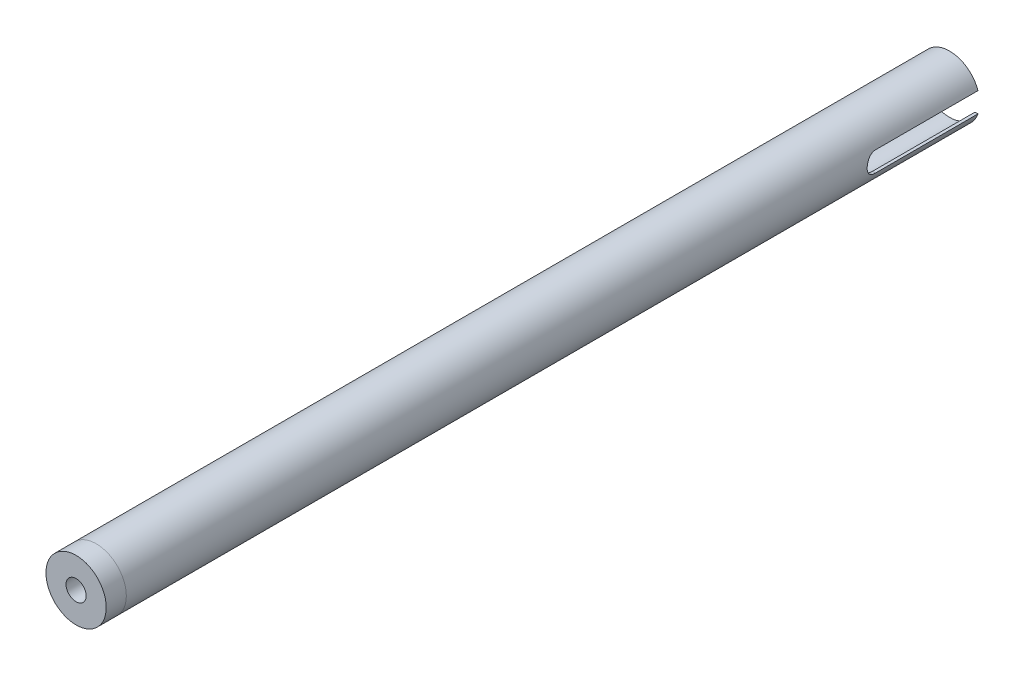
ISO-10303-21;
HEADER;
FILE_DESCRIPTION(('STEP AP214'),'2;1');
FILE_NAME('part.step','',(''),(''),'','','');
FILE_SCHEMA(('AUTOMOTIVE_DESIGN { 1 0 10303 214 1 1 1 1 }'));
ENDSEC;
DATA;
#1=APPLICATION_CONTEXT('core data for automotive mechanical design processes');
#2=APPLICATION_PROTOCOL_DEFINITION('international standard','automotive_design',2000,#1);
#3=PRODUCT_CONTEXT('',#1,'mechanical');
#4=PRODUCT('Part','Part','',(#3));
#5=PRODUCT_RELATED_PRODUCT_CATEGORY('part','',(#4));
#6=PRODUCT_DEFINITION_FORMATION('','',#4);
#7=PRODUCT_DEFINITION_CONTEXT('part definition',#1,'design');
#8=PRODUCT_DEFINITION('design','',#6,#7);
#9=PRODUCT_DEFINITION_SHAPE('','',#8);
#10=(LENGTH_UNIT() NAMED_UNIT(*) SI_UNIT(.MILLI.,.METRE.));
#11=(NAMED_UNIT(*) PLANE_ANGLE_UNIT() SI_UNIT($,.RADIAN.));
#12=(NAMED_UNIT(*) SI_UNIT($,.STERADIAN.) SOLID_ANGLE_UNIT());
#13=UNCERTAINTY_MEASURE_WITH_UNIT(LENGTH_MEASURE(1.E-05),#10,'distance_accuracy_value','');
#14=(GEOMETRIC_REPRESENTATION_CONTEXT(3) GLOBAL_UNCERTAINTY_ASSIGNED_CONTEXT((#13)) GLOBAL_UNIT_ASSIGNED_CONTEXT((#10,
#11,#12)) REPRESENTATION_CONTEXT('',''));
#15=CARTESIAN_POINT('',(0.,0.,0.));
#16=DIRECTION('',(0.,0.,1.));
#17=DIRECTION('',(1.,0.,0.));
#18=AXIS2_PLACEMENT_3D('',#15,#16,#17);
#19=CARTESIAN_POINT('',(0.,0.,-275.981356586574));
#20=DIRECTION('',(0.,0.,1.));
#21=DIRECTION('',(1.,0.,0.));
#22=AXIS2_PLACEMENT_3D('',#19,#20,#21);
#23=CYLINDRICAL_SURFACE('',#22,9.525);
#24=CARTESIAN_POINT('',(0.,0.,-6.35));
#25=DIRECTION('',(0.,0.,1.));
#26=DIRECTION('',(1.,0.,0.));
#27=AXIS2_PLACEMENT_3D('',#24,#25,#26);
#28=CIRCLE('',#27,9.525);
#29=CARTESIAN_POINT('',(9.525,0.,-6.35));
#30=VERTEX_POINT('',#29);
#31=EDGE_CURVE('E167',#30,#30,#28,.T.);
#32=ORIENTED_EDGE('',*,*,#31,.F.);
#33=EDGE_LOOP('',(#32));
#34=FACE_BOUND('',#33,.T.);
#35=CARTESIAN_POINT('',(-8.98025612106915,3.175,-243.596356586574));
#36=CARTESIAN_POINT('',(-8.98024230233901,3.17501142134308,-243.509730483238));
#37=CARTESIAN_POINT('',(-8.98150922759707,3.17145501317748,-243.423112100762));
#38=CARTESIAN_POINT('',(-8.98650170400112,3.1572955094353,-243.250547285936));
#39=CARTESIAN_POINT('',(-8.99022659113085,3.14669431699564,-243.164600678451));
#40=CARTESIAN_POINT('',(-9.00001740508998,3.11857670914846,-242.994246437286));
#41=CARTESIAN_POINT('',(-9.00607621805002,3.10108130380329,-242.909834935478));
#42=CARTESIAN_POINT('',(-9.02033586435303,3.05935434973545,-242.742900134143));
#43=CARTESIAN_POINT('',(-9.02853677497232,3.03512255799513,-242.660376902851));
#44=CARTESIAN_POINT('',(-9.05598792154067,2.95264369348964,-242.416578279575));
#45=CARTESIAN_POINT('',(-9.07810200713862,2.88457148458964,-242.258824695251));
#46=CARTESIAN_POINT('',(-9.127451360236,2.72437908867647,-241.956948176762));
#47=CARTESIAN_POINT('',(-9.15468995097455,2.63224328129309,-241.812834179533));
#48=CARTESIAN_POINT('',(-9.21240416673121,2.42269155952414,-241.536681319709));
#49=CARTESIAN_POINT('',(-9.24296008478943,2.30449853156512,-241.405247737847));
#50=CARTESIAN_POINT('',(-9.30318902123143,2.04784031127145,-241.16365244151));
#51=CARTESIAN_POINT('',(-9.33286185998227,1.90937102786996,-241.053495030278));
#52=CARTESIAN_POINT('',(-9.38892492365178,1.61159672697579,-240.85477801879));
#53=CARTESIAN_POINT('',(-9.41520772598947,1.45183792838569,-240.76686583278));
#54=CARTESIAN_POINT('',(-9.46054712430069,1.11883883316161,-240.61946110671));
#55=CARTESIAN_POINT('',(-9.47961052807859,0.945611424033749,-240.559941778708));
#56=CARTESIAN_POINT('',(-9.50410661247238,0.642992499572345,-240.484463014213));
#57=CARTESIAN_POINT('',(-9.51189798251809,0.515662964135989,-240.460845042169));
#58=CARTESIAN_POINT('',(-9.51973491912187,0.323120458247677,-240.437178775996));
#59=CARTESIAN_POINT('',(-9.52170555244691,0.258670486244967,-240.431250128379));
#60=CARTESIAN_POINT('',(-9.52433958502699,0.129484930346638,-240.423337503713));
#61=CARTESIAN_POINT('',(-9.5250026318504,0.0647492741617516,-240.421354590148));
#62=CARTESIAN_POINT('',(-9.525,0.,-240.421356586574));
#63=B_SPLINE_CURVE_WITH_KNOTS('',3,(#35,#36,#37,#38,#39,#40,#41,#42,#43,#44,#45,#46,#47,#48,#49,
#50,#51,#52,#53,#54,#55,#56,#57,#58,#59,#60,#61,#62),.UNSPECIFIED.,.F.,.F.,(4,2,2,2,2,2,2,2,2,2,
2,2,2,4),(0.,0.259783027985073,0.519495904525415,0.778423354079382,1.0373601457496,
1.55448370709136,2.07194378605916,2.60765740005747,3.14347925237351,3.69345572792677,
4.24291228331232,4.63105001394517,4.8251849841295,5.01937227204627),.UNSPECIFIED.);
#64=CARTESIAN_POINT('',(-8.98025612106915,3.175,-243.596356586574));
#65=VERTEX_POINT('',#64);
#66=CARTESIAN_POINT('',(-9.525,0.,-240.421356586574));
#67=VERTEX_POINT('',#66);
#68=EDGE_CURVE('E194',#65,#67,#63,.T.);
#69=ORIENTED_EDGE('',*,*,#68,.T.);
#70=CARTESIAN_POINT('',(-9.525,0.,-240.421356586574));
#71=CARTESIAN_POINT('',(-9.52501110102584,-0.0867614879611002,-240.421345481537));
#72=CARTESIAN_POINT('',(-9.52381482114642,-0.173516026970682,-240.424912693194));
#73=CARTESIAN_POINT('',(-9.51909010104991,-0.346361025979099,-240.439117531776));
#74=CARTESIAN_POINT('',(-9.51556219632442,-0.432451633867615,-240.449753535253));
#75=CARTESIAN_POINT('',(-9.50626969526085,-0.603121388983422,-240.477970526766));
#76=CARTESIAN_POINT('',(-9.50051134567603,-0.687704073408633,-240.495532120935));
#77=CARTESIAN_POINT('',(-9.48692170416637,-0.854983898510568,-240.537423441573));
#78=CARTESIAN_POINT('',(-9.47909035815865,-0.937680989932476,-240.561753344623));
#79=CARTESIAN_POINT('',(-9.45278540829331,-1.18202731628103,-240.644587737561));
#80=CARTESIAN_POINT('',(-9.43148823554423,-1.34014986693319,-240.712973418907));
#81=CARTESIAN_POINT('',(-9.38354405256208,-1.64264414222567,-240.873899944683));
#82=CARTESIAN_POINT('',(-9.35689419571071,-1.78700848960572,-240.966453649836));
#83=CARTESIAN_POINT('',(-9.30002401422067,-2.06291632995429,-241.176447078041));
#84=CARTESIAN_POINT('',(-9.26971861159363,-2.19392359690275,-241.294569363461));
#85=CARTESIAN_POINT('',(-9.20941732427212,-2.43468689521898,-241.550907340296));
#86=CARTESIAN_POINT('',(-9.1794215361322,-2.54443647619592,-241.689129108454));
#87=CARTESIAN_POINT('',(-9.122187697517,-2.74268087840455,-241.986637087501));
#88=CARTESIAN_POINT('',(-9.09505529775998,-2.83046425019683,-242.146419225575));
#89=CARTESIAN_POINT('',(-9.04794936227173,-2.97762337182932,-242.47946354758));
#90=CARTESIAN_POINT('',(-9.0279682579705,-3.03702917747986,-242.652711242388));
#91=CARTESIAN_POINT('',(-9.00226999890487,-3.11221256504251,-242.954998276382));
#92=CARTESIAN_POINT('',(-8.99408207355733,-3.13569679171672,-243.08196059781));
#93=CARTESIAN_POINT('',(-8.98304472933549,-3.16711304593222,-243.338037769579));
#94=CARTESIAN_POINT('',(-8.98019613476149,-3.17504267212105,-243.467152949181));
#95=CARTESIAN_POINT('',(-8.98025612106915,-3.175,-243.596356586574));
#96=B_SPLINE_CURVE_WITH_KNOTS('',3,(#70,#71,#72,#73,#74,#75,#76,#77,#78,#79,#80,#81,#82,#83,#84,
#85,#86,#87,#88,#89,#90,#91,#92,#93,#94,#95),.UNSPECIFIED.,.F.,.F.,(4,2,2,2,2,2,2,2,2,2,2,2,4),
(0.,0.260191091827301,0.520322447737218,0.779730467212509,1.03914525511039,1.55731822615721,
2.07576750062864,2.61028978360819,3.14497400776477,3.69521752133767,4.24487695078963,
4.63199348452993,5.01916977744545),.UNSPECIFIED.);
#97=CARTESIAN_POINT('',(-8.98025612106916,-3.175,-243.596356586574));
#98=VERTEX_POINT('',#97);
#99=EDGE_CURVE('E146',#67,#98,#96,.T.);
#100=ORIENTED_EDGE('',*,*,#99,.T.);
#101=DIRECTION('',(0.,0.,-1.));
#102=VECTOR('',#101,1.);
#103=CARTESIAN_POINT('',(-8.98025612106916,-3.175,-240.421356586574));
#104=LINE('',#103,#102);
#105=CARTESIAN_POINT('',(-8.98025612106916,-3.175,-275.981356586574));
#106=VERTEX_POINT('',#105);
#107=EDGE_CURVE('E141',#98,#106,#104,.T.);
#108=ORIENTED_EDGE('',*,*,#107,.T.);
#109=CARTESIAN_POINT('',(0.,0.,-275.981356586574));
#110=DIRECTION('',(0.,0.,1.));
#111=DIRECTION('',(1.,0.,0.));
#112=AXIS2_PLACEMENT_3D('',#109,#110,#111);
#113=CIRCLE('',#112,9.525);
#114=CARTESIAN_POINT('',(8.98025612106915,-3.175,-275.981356586574));
#115=VERTEX_POINT('',#114);
#116=EDGE_CURVE('E144',#106,#115,#113,.T.);
#117=ORIENTED_EDGE('',*,*,#116,.T.);
#118=DIRECTION('',(0.,0.,-1.));
#119=VECTOR('',#118,1.);
#120=CARTESIAN_POINT('',(8.98025612106915,-3.175,-240.421356586574));
#121=LINE('',#120,#119);
#122=CARTESIAN_POINT('',(8.98025612106915,-3.175,-243.596356586574));
#123=VERTEX_POINT('',#122);
#124=EDGE_CURVE('E427',#123,#115,#121,.T.);
#125=ORIENTED_EDGE('',*,*,#124,.F.);
#126=CARTESIAN_POINT('',(8.98025612106915,-3.175,-243.596356586574));
#127=CARTESIAN_POINT('',(8.98024230233901,-3.17501142134308,-243.509730483238));
#128=CARTESIAN_POINT('',(8.98150922759707,-3.17145501317748,-243.423112100762));
#129=CARTESIAN_POINT('',(8.98650170400112,-3.1572955094353,-243.250547285936));
#130=CARTESIAN_POINT('',(8.99022659113085,-3.14669431699564,-243.164600678451));
#131=CARTESIAN_POINT('',(9.00001740508998,-3.11857670914846,-242.994246437286));
#132=CARTESIAN_POINT('',(9.00607621805002,-3.10108130380329,-242.909834935478));
#133=CARTESIAN_POINT('',(9.02033586435303,-3.05935434973545,-242.742900134143));
#134=CARTESIAN_POINT('',(9.02853677497232,-3.03512255799513,-242.660376902851));
#135=CARTESIAN_POINT('',(9.05598792154067,-2.95264369348964,-242.416578279575));
#136=CARTESIAN_POINT('',(9.07810200713862,-2.88457148458964,-242.258824695251));
#137=CARTESIAN_POINT('',(9.127451360236,-2.72437908867647,-241.956948176762));
#138=CARTESIAN_POINT('',(9.15468995097455,-2.63224328129309,-241.812834179533));
#139=CARTESIAN_POINT('',(9.21240416673121,-2.42269155952414,-241.536681319709));
#140=CARTESIAN_POINT('',(9.24296008478943,-2.30449853156512,-241.405247737847));
#141=CARTESIAN_POINT('',(9.30318902123143,-2.04784031127145,-241.16365244151));
#142=CARTESIAN_POINT('',(9.33286185998227,-1.90937102786996,-241.053495030278));
#143=CARTESIAN_POINT('',(9.38892492365178,-1.61159672697579,-240.85477801879));
#144=CARTESIAN_POINT('',(9.41520772598947,-1.45183792838569,-240.76686583278));
#145=CARTESIAN_POINT('',(9.46054712430069,-1.11883883316161,-240.61946110671));
#146=CARTESIAN_POINT('',(9.47961052807859,-0.945611424033749,-240.559941778708));
#147=CARTESIAN_POINT('',(9.50410661247238,-0.642992499572345,-240.484463014213));
#148=CARTESIAN_POINT('',(9.51189798251809,-0.515662964135989,-240.460845042169));
#149=CARTESIAN_POINT('',(9.51973491912187,-0.323120458247677,-240.437178775996));
#150=CARTESIAN_POINT('',(9.52170555244691,-0.258670486244967,-240.431250128379));
#151=CARTESIAN_POINT('',(9.52433958502699,-0.129484930346638,-240.423337503713));
#152=CARTESIAN_POINT('',(9.5250026318504,-0.0647492741617516,-240.421354590148));
#153=CARTESIAN_POINT('',(9.525,0.,-240.421356586574));
#154=B_SPLINE_CURVE_WITH_KNOTS('',3,(#126,#127,#128,#129,#130,#131,#132,#133,#134,#135,#136,
#137,#138,#139,#140,#141,#142,#143,#144,#145,#146,#147,#148,#149,#150,#151,#152,#153),
.UNSPECIFIED.,.F.,.F.,(4,2,2,2,2,2,2,2,2,2,2,2,2,4),(0.,0.259783027985073,0.519495904525415,
0.778423354079382,1.0373601457496,1.55448370709136,2.07194378605916,2.60765740005747,
3.14347925237351,3.69345572792677,4.24291228331232,4.63105001394517,4.8251849841295,
5.01937227204627),.UNSPECIFIED.);
#155=CARTESIAN_POINT('',(9.525,0.,-240.421356586574));
#156=VERTEX_POINT('',#155);
#157=EDGE_CURVE('E87',#123,#156,#154,.T.);
#158=ORIENTED_EDGE('',*,*,#157,.T.);
#159=CARTESIAN_POINT('',(9.525,0.,-240.421356586574));
#160=CARTESIAN_POINT('',(9.52501110102584,0.0867614879611002,-240.421345481537));
#161=CARTESIAN_POINT('',(9.52381482114642,0.173516026970682,-240.424912693194));
#162=CARTESIAN_POINT('',(9.51909010104991,0.346361025979099,-240.439117531776));
#163=CARTESIAN_POINT('',(9.51556219632442,0.432451633867615,-240.449753535253));
#164=CARTESIAN_POINT('',(9.50626969526085,0.603121388983422,-240.477970526766));
#165=CARTESIAN_POINT('',(9.50051134567603,0.687704073408633,-240.495532120935));
#166=CARTESIAN_POINT('',(9.48692170416637,0.854983898510568,-240.537423441573));
#167=CARTESIAN_POINT('',(9.47909035815865,0.937680989932476,-240.561753344623));
#168=CARTESIAN_POINT('',(9.45278540829331,1.18202731628103,-240.644587737561));
#169=CARTESIAN_POINT('',(9.43148823554423,1.34014986693319,-240.712973418907));
#170=CARTESIAN_POINT('',(9.38354405256208,1.64264414222567,-240.873899944683));
#171=CARTESIAN_POINT('',(9.35689419571071,1.78700848960572,-240.966453649836));
#172=CARTESIAN_POINT('',(9.30002401422067,2.06291632995429,-241.176447078041));
#173=CARTESIAN_POINT('',(9.26971861159363,2.19392359690275,-241.294569363461));
#174=CARTESIAN_POINT('',(9.20941732427212,2.43468689521898,-241.550907340296));
#175=CARTESIAN_POINT('',(9.1794215361322,2.54443647619592,-241.689129108454));
#176=CARTESIAN_POINT('',(9.122187697517,2.74268087840455,-241.986637087501));
#177=CARTESIAN_POINT('',(9.09505529775998,2.83046425019683,-242.146419225575));
#178=CARTESIAN_POINT('',(9.04794936227173,2.97762337182932,-242.47946354758));
#179=CARTESIAN_POINT('',(9.0279682579705,3.03702917747986,-242.652711242388));
#180=CARTESIAN_POINT('',(9.00226999890487,3.11221256504251,-242.954998276382));
#181=CARTESIAN_POINT('',(8.99408207355733,3.13569679171672,-243.08196059781));
#182=CARTESIAN_POINT('',(8.98304472933549,3.16711304593222,-243.338037769579));
#183=CARTESIAN_POINT('',(8.98019613476149,3.17504267212105,-243.467152949181));
#184=CARTESIAN_POINT('',(8.98025612106915,3.175,-243.596356586574));
#185=B_SPLINE_CURVE_WITH_KNOTS('',3,(#159,#160,#161,#162,#163,#164,#165,#166,#167,#168,#169,
#170,#171,#172,#173,#174,#175,#176,#177,#178,#179,#180,#181,#182,#183,#184),.UNSPECIFIED.,.F.,
.F.,(4,2,2,2,2,2,2,2,2,2,2,2,4),(0.,0.260191091827301,0.520322447737218,0.779730467212509,
1.03914525511039,1.55731822615721,2.07576750062864,2.61028978360819,3.14497400776477,
3.69521752133767,4.24487695078963,4.63199348452993,5.01916977744545),.UNSPECIFIED.);
#186=CARTESIAN_POINT('',(8.98025612106915,3.175,-243.596356586574));
#187=VERTEX_POINT('',#186);
#188=EDGE_CURVE('E73',#156,#187,#185,.T.);
#189=ORIENTED_EDGE('',*,*,#188,.T.);
#190=DIRECTION('',(0.,0.,-1.));
#191=VECTOR('',#190,1.);
#192=CARTESIAN_POINT('',(8.98025612106915,3.175,-240.421356586574));
#193=LINE('',#192,#191);
#194=CARTESIAN_POINT('',(8.98025612106915,3.175,-275.981356586574));
#195=VERTEX_POINT('',#194);
#196=EDGE_CURVE('E160',#187,#195,#193,.T.);
#197=ORIENTED_EDGE('',*,*,#196,.T.);
#198=CARTESIAN_POINT('',(-8.98025612106915,3.175,-275.981356586574));
#199=VERTEX_POINT('',#198);
#200=EDGE_CURVE('E166',#195,#199,#113,.T.);
#201=ORIENTED_EDGE('',*,*,#200,.T.);
#202=DIRECTION('',(0.,0.,-1.));
#203=VECTOR('',#202,1.);
#204=CARTESIAN_POINT('',(-8.98025612106915,3.175,-240.421356586574));
#205=LINE('',#204,#203);
#206=EDGE_CURVE('E420',#65,#199,#205,.T.);
#207=ORIENTED_EDGE('',*,*,#206,.F.);
#208=EDGE_LOOP('',(#69,#100,#108,#117,#125,#158,#189,#197,#201,#207));
#209=FACE_BOUND('',#208,.T.);
#210=ADVANCED_FACE('F63',(#34,#209),#23,.T.);
#211=CARTESIAN_POINT('',(0.,0.,-275.981356586574));
#212=DIRECTION('',(0.,0.,1.));
#213=DIRECTION('',(1.,0.,0.));
#214=AXIS2_PLACEMENT_3D('',#211,#212,#213);
#215=PLANE('',#214);
#216=DIRECTION('',(1.,0.,0.));
#217=VECTOR('',#216,1.);
#218=CARTESIAN_POINT('',(0.,-3.175,-275.981356586574));
#219=LINE('',#218,#217);
#220=CARTESIAN_POINT('',(-8.03118117091129,-3.175,-275.981356586574));
#221=VERTEX_POINT('',#220);
#222=EDGE_CURVE('E153',#106,#221,#219,.T.);
#223=ORIENTED_EDGE('',*,*,#222,.T.);
#224=CARTESIAN_POINT('',(0.,0.,-275.981356586574));
#225=DIRECTION('',(0.,0.,1.));
#226=DIRECTION('',(1.,0.,0.));
#227=AXIS2_PLACEMENT_3D('',#224,#225,#226);
#228=CIRCLE('',#227,8.636);
#229=CARTESIAN_POINT('',(8.03118117091129,-3.175,-275.981356586574));
#230=VERTEX_POINT('',#229);
#231=EDGE_CURVE('E275',#221,#230,#228,.T.);
#232=ORIENTED_EDGE('',*,*,#231,.T.);
#233=DIRECTION('',(1.,0.,0.));
#234=VECTOR('',#233,1.);
#235=CARTESIAN_POINT('',(0.,-3.175,-275.981356586574));
#236=LINE('',#235,#234);
#237=EDGE_CURVE('E165',#230,#115,#236,.T.);
#238=ORIENTED_EDGE('',*,*,#237,.T.);
#239=ORIENTED_EDGE('',*,*,#116,.F.);
#240=EDGE_LOOP('',(#223,#232,#238,#239));
#241=FACE_BOUND('',#240,.T.);
#242=ADVANCED_FACE('F163',(#241),#215,.F.);
#243=CARTESIAN_POINT('',(0.,0.,-275.981356586574));
#244=DIRECTION('',(0.,0.,1.));
#245=DIRECTION('',(1.,0.,0.));
#246=AXIS2_PLACEMENT_3D('',#243,#244,#245);
#247=CYLINDRICAL_SURFACE('',#246,8.636);
#248=CARTESIAN_POINT('',(0.,0.,-6.35));
#249=DIRECTION('',(0.,0.,1.));
#250=DIRECTION('',(1.,0.,0.));
#251=AXIS2_PLACEMENT_3D('',#248,#249,#250);
#252=CIRCLE('',#251,8.636);
#253=CARTESIAN_POINT('',(8.636,0.,-6.35));
#254=VERTEX_POINT('',#253);
#255=EDGE_CURVE('E149',#254,#254,#252,.T.);
#256=ORIENTED_EDGE('',*,*,#255,.T.);
#257=EDGE_LOOP('',(#256));
#258=FACE_BOUND('',#257,.T.);
#259=DIRECTION('',(0.,0.,-1.));
#260=VECTOR('',#259,1.);
#261=CARTESIAN_POINT('',(-8.03118117091129,-3.175,-240.421356586574));
#262=LINE('',#261,#260);
#263=CARTESIAN_POINT('',(-8.03118117091129,-3.175,-243.596356586574));
#264=VERTEX_POINT('',#263);
#265=EDGE_CURVE('E150',#264,#221,#262,.T.);
#266=ORIENTED_EDGE('',*,*,#265,.F.);
#267=CARTESIAN_POINT('',(-8.03118117091129,-3.175,-243.596356586574));
#268=CARTESIAN_POINT('',(-8.03116550357192,-3.17501203663229,-243.510321618458));
#269=CARTESIAN_POINT('',(-8.03256328665432,-3.17150327993898,-243.424295265929));
#270=CARTESIAN_POINT('',(-8.03806891362409,-3.15753809299539,-243.25292269546));
#271=CARTESIAN_POINT('',(-8.04217588089715,-3.147083910078,-243.167576266554));
#272=CARTESIAN_POINT('',(-8.05296421917626,-3.11937037021479,-242.998467132338));
#273=CARTESIAN_POINT('',(-8.05963650808002,-3.10213501593151,-242.914699921396));
#274=CARTESIAN_POINT('',(-8.07533202922415,-3.06104389654163,-242.749050958628));
#275=CARTESIAN_POINT('',(-8.08435537430867,-3.03718781365489,-242.667169297509));
#276=CARTESIAN_POINT('',(-8.11453837074661,-2.95603278100126,-242.425317140264));
#277=CARTESIAN_POINT('',(-8.13883087950845,-2.88909903597751,-242.268850502688));
#278=CARTESIAN_POINT('',(-8.19300406693487,-2.7316794881875,-241.969315513563));
#279=CARTESIAN_POINT('',(-8.2228893144862,-2.64117440539559,-241.826258261007));
#280=CARTESIAN_POINT('',(-8.28646461334555,-2.43457537576573,-241.550787851769));
#281=CARTESIAN_POINT('',(-8.32026315150129,-2.31754645569598,-241.419099479682));
#282=CARTESIAN_POINT('',(-8.38695072719909,-2.06320558041452,-241.176711301288));
#283=CARTESIAN_POINT('',(-8.41983956911545,-1.92588930215217,-241.066015979918));
#284=CARTESIAN_POINT('',(-8.48230406273647,-1.62932475427475,-240.865234864968));
#285=CARTESIAN_POINT('',(-8.51173519592471,-1.46950375402868,-240.775946511462));
#286=CARTESIAN_POINT('',(-8.56262575627031,-1.13591027783605,-240.625884358498));
#287=CARTESIAN_POINT('',(-8.58409342507971,-0.962152453429188,-240.565081061679));
#288=CARTESIAN_POINT('',(-8.61197450421745,-0.656412542712551,-240.487156696029));
#289=CARTESIAN_POINT('',(-8.62092967235125,-0.52653821034923,-240.46254091169));
#290=CARTESIAN_POINT('',(-8.62994176115801,-0.33002097693849,-240.437863579975));
#291=CARTESIAN_POINT('',(-8.63220903333297,-0.264206342476339,-240.431678840824));
#292=CARTESIAN_POINT('',(-8.63523992352765,-0.132266265743968,-240.423423625379));
#293=CARTESIAN_POINT('',(-8.6360031097792,-0.0661407396870625,-240.421354330476));
#294=CARTESIAN_POINT('',(-8.636,0.,-240.421356586574));
#295=B_SPLINE_CURVE_WITH_KNOTS('',3,(#267,#268,#269,#270,#271,#272,#273,#274,#275,#276,#277,
#278,#279,#280,#281,#282,#283,#284,#285,#286,#287,#288,#289,#290,#291,#292,#293,#294),
.UNSPECIFIED.,.F.,.F.,(4,2,2,2,2,2,2,2,2,2,2,2,2,4),(0.,0.258007583993629,0.515931725057033,
0.772951013405637,1.02998264023841,1.54317615093285,2.05679075055087,2.59254838663383,
3.12842035287703,3.68191422398172,4.23483365719867,4.63113823379686,4.8294369210689,
5.02779252437178),.UNSPECIFIED.);
#296=CARTESIAN_POINT('',(-8.636,0.,-240.421356586574));
#297=VERTEX_POINT('',#296);
#298=EDGE_CURVE('E221',#264,#297,#295,.T.);
#299=ORIENTED_EDGE('',*,*,#298,.T.);
#300=CARTESIAN_POINT('',(-8.636,0.,-240.421356586574));
#301=CARTESIAN_POINT('',(-8.63601200177566,0.0862340545028649,-240.42134501285));
#302=CARTESIAN_POINT('',(-8.63470866649585,0.172460638964014,-240.424869552871));
#303=CARTESIAN_POINT('',(-8.62956076290727,0.34424536862396,-240.438900982501));
#304=CARTESIAN_POINT('',(-8.62571686385256,0.429803683858972,-240.449406033257));
#305=CARTESIAN_POINT('',(-8.61559314175803,0.599377201936824,-240.477264787312));
#306=CARTESIAN_POINT('',(-8.60932102288695,0.683396413719316,-240.494596833168));
#307=CARTESIAN_POINT('',(-8.5945171663722,0.84955353944947,-240.535928056444));
#308=CARTESIAN_POINT('',(-8.58598535382315,0.931691390934835,-240.559927454877));
#309=CARTESIAN_POINT('',(-8.55732464851214,1.17435074221828,-240.641601636314));
#310=CARTESIAN_POINT('',(-8.53411500636261,1.33136171263577,-240.708992957281));
#311=CARTESIAN_POINT('',(-8.48180653117632,1.63181198358794,-240.86748466729));
#312=CARTESIAN_POINT('',(-8.45270389942466,1.77524244193608,-240.958600360327));
#313=CARTESIAN_POINT('',(-8.39029834803106,2.05036661398533,-241.165853478006));
#314=CARTESIAN_POINT('',(-8.35688032192871,2.18143474113563,-241.282787845598));
#315=CARTESIAN_POINT('',(-8.29018507770489,2.42260670191498,-241.536676832055));
#316=CARTESIAN_POINT('',(-8.25690791509208,2.53270290926751,-241.673638701885));
#317=CARTESIAN_POINT('',(-8.19291826363247,2.73277128594142,-241.96980379071));
#318=CARTESIAN_POINT('',(-8.16234475412033,2.82185641770733,-242.129638880147));
#319=CARTESIAN_POINT('',(-8.10906121054024,2.97153048258985,-242.463234223649));
#320=CARTESIAN_POINT('',(-8.08634169503735,3.03215380703845,-242.636977373318));
#321=CARTESIAN_POINT('',(-8.05677760160867,3.10966172606007,-242.94224600813));
#322=CARTESIAN_POINT('',(-8.04725077861386,3.13409804308656,-243.071626727336));
#323=CARTESIAN_POINT('',(-8.03764862425496,3.15860280233702,-243.267433853177));
#324=CARTESIAN_POINT('',(-8.0352292163598,3.16474613160122,-243.333026609483));
#325=CARTESIAN_POINT('',(-8.03199317651195,3.17294655384153,-243.464526561872));
#326=CARTESIAN_POINT('',(-8.03117703985816,3.17500238406813,-243.530433848823));
#327=CARTESIAN_POINT('',(-8.03118117091129,3.175,-243.596356586574));
#328=B_SPLINE_CURVE_WITH_KNOTS('',3,(#300,#301,#302,#303,#304,#305,#306,#307,#308,#309,#310,
#311,#312,#313,#314,#315,#316,#317,#318,#319,#320,#321,#322,#323,#324,#325,#326,#327),
.UNSPECIFIED.,.F.,.F.,(4,2,2,2,2,2,2,2,2,2,2,2,2,4),(0.,0.258607684277236,0.517147271349145,
0.774873208333403,1.0326076896076,1.54734347080468,2.06241212125686,2.59642224394464,
3.13062618611959,3.68443916069367,4.237581211598,4.63245186558866,4.83009172977029,
5.02779264127874),.UNSPECIFIED.);
#329=CARTESIAN_POINT('',(-8.03118117091129,3.175,-243.596356586574));
#330=VERTEX_POINT('',#329);
#331=EDGE_CURVE('E186',#297,#330,#328,.T.);
#332=ORIENTED_EDGE('',*,*,#331,.T.);
#333=DIRECTION('',(0.,0.,-1.));
#334=VECTOR('',#333,1.);
#335=CARTESIAN_POINT('',(-8.03118117091129,3.175,-240.421356586574));
#336=LINE('',#335,#334);
#337=CARTESIAN_POINT('',(-8.03118117091129,3.175,-275.981356586574));
#338=VERTEX_POINT('',#337);
#339=EDGE_CURVE('E417',#330,#338,#336,.T.);
#340=ORIENTED_EDGE('',*,*,#339,.T.);
#341=CARTESIAN_POINT('',(8.03118117091129,3.175,-275.981356586574));
#342=VERTEX_POINT('',#341);
#343=EDGE_CURVE('E172',#342,#338,#228,.T.);
#344=ORIENTED_EDGE('',*,*,#343,.F.);
#345=DIRECTION('',(0.,0.,-1.));
#346=VECTOR('',#345,1.);
#347=CARTESIAN_POINT('',(8.03118117091129,3.175,-240.421356586574));
#348=LINE('',#347,#346);
#349=CARTESIAN_POINT('',(8.03118117091129,3.175,-243.596356586574));
#350=VERTEX_POINT('',#349);
#351=EDGE_CURVE('E269',#350,#342,#348,.T.);
#352=ORIENTED_EDGE('',*,*,#351,.F.);
#353=CARTESIAN_POINT('',(8.03118117091129,3.175,-243.596356586574));
#354=CARTESIAN_POINT('',(8.03116550357192,3.17501203663229,-243.510321618458));
#355=CARTESIAN_POINT('',(8.03256328665432,3.17150327993898,-243.424295265929));
#356=CARTESIAN_POINT('',(8.03806891362409,3.15753809299539,-243.25292269546));
#357=CARTESIAN_POINT('',(8.04217588089715,3.147083910078,-243.167576266554));
#358=CARTESIAN_POINT('',(8.05296421917626,3.11937037021479,-242.998467132338));
#359=CARTESIAN_POINT('',(8.05963650808002,3.10213501593151,-242.914699921396));
#360=CARTESIAN_POINT('',(8.07533202922415,3.06104389654163,-242.749050958628));
#361=CARTESIAN_POINT('',(8.08435537430867,3.03718781365489,-242.667169297509));
#362=CARTESIAN_POINT('',(8.11453837074661,2.95603278100126,-242.425317140264));
#363=CARTESIAN_POINT('',(8.13883087950845,2.88909903597751,-242.268850502688));
#364=CARTESIAN_POINT('',(8.19300406693487,2.7316794881875,-241.969315513563));
#365=CARTESIAN_POINT('',(8.2228893144862,2.64117440539559,-241.826258261007));
#366=CARTESIAN_POINT('',(8.28646461334555,2.43457537576573,-241.550787851769));
#367=CARTESIAN_POINT('',(8.32026315150129,2.31754645569598,-241.419099479682));
#368=CARTESIAN_POINT('',(8.38695072719909,2.06320558041452,-241.176711301288));
#369=CARTESIAN_POINT('',(8.41983956911545,1.92588930215217,-241.066015979918));
#370=CARTESIAN_POINT('',(8.48230406273647,1.62932475427475,-240.865234864968));
#371=CARTESIAN_POINT('',(8.51173519592471,1.46950375402868,-240.775946511462));
#372=CARTESIAN_POINT('',(8.56262575627031,1.13591027783605,-240.625884358498));
#373=CARTESIAN_POINT('',(8.58409342507971,0.962152453429188,-240.565081061679));
#374=CARTESIAN_POINT('',(8.61197450421745,0.656412542712551,-240.487156696029));
#375=CARTESIAN_POINT('',(8.62092967235125,0.52653821034923,-240.46254091169));
#376=CARTESIAN_POINT('',(8.62994176115801,0.33002097693849,-240.437863579975));
#377=CARTESIAN_POINT('',(8.63220903333297,0.264206342476339,-240.431678840824));
#378=CARTESIAN_POINT('',(8.63523992352765,0.132266265743968,-240.423423625379));
#379=CARTESIAN_POINT('',(8.6360031097792,0.0661407396870625,-240.421354330476));
#380=CARTESIAN_POINT('',(8.636,0.,-240.421356586574));
#381=B_SPLINE_CURVE_WITH_KNOTS('',3,(#353,#354,#355,#356,#357,#358,#359,#360,#361,#362,#363,
#364,#365,#366,#367,#368,#369,#370,#371,#372,#373,#374,#375,#376,#377,#378,#379,#380),
.UNSPECIFIED.,.F.,.F.,(4,2,2,2,2,2,2,2,2,2,2,2,2,4),(0.,0.258007583993629,0.515931725057033,
0.772951013405637,1.02998264023841,1.54317615093285,2.05679075055087,2.59254838663383,
3.12842035287703,3.68191422398172,4.23483365719867,4.63113823379686,4.8294369210689,
5.02779252437178),.UNSPECIFIED.);
#382=CARTESIAN_POINT('',(8.636,0.,-240.421356586574));
#383=VERTEX_POINT('',#382);
#384=EDGE_CURVE('E13',#350,#383,#381,.T.);
#385=ORIENTED_EDGE('',*,*,#384,.T.);
#386=CARTESIAN_POINT('',(8.636,0.,-240.421356586574));
#387=CARTESIAN_POINT('',(8.63601200177566,-0.0862340545028649,-240.42134501285));
#388=CARTESIAN_POINT('',(8.63470866649585,-0.172460638964014,-240.424869552871));
#389=CARTESIAN_POINT('',(8.62956076290727,-0.34424536862396,-240.438900982501));
#390=CARTESIAN_POINT('',(8.62571686385256,-0.429803683858972,-240.449406033257));
#391=CARTESIAN_POINT('',(8.61559314175803,-0.599377201936824,-240.477264787312));
#392=CARTESIAN_POINT('',(8.60932102288695,-0.683396413719316,-240.494596833168));
#393=CARTESIAN_POINT('',(8.5945171663722,-0.84955353944947,-240.535928056444));
#394=CARTESIAN_POINT('',(8.58598535382315,-0.931691390934835,-240.559927454877));
#395=CARTESIAN_POINT('',(8.55732464851214,-1.17435074221828,-240.641601636314));
#396=CARTESIAN_POINT('',(8.53411500636261,-1.33136171263577,-240.708992957281));
#397=CARTESIAN_POINT('',(8.48180653117632,-1.63181198358794,-240.86748466729));
#398=CARTESIAN_POINT('',(8.45270389942466,-1.77524244193608,-240.958600360327));
#399=CARTESIAN_POINT('',(8.39029834803106,-2.05036661398533,-241.165853478006));
#400=CARTESIAN_POINT('',(8.35688032192871,-2.18143474113563,-241.282787845598));
#401=CARTESIAN_POINT('',(8.29018507770489,-2.42260670191498,-241.536676832055));
#402=CARTESIAN_POINT('',(8.25690791509208,-2.53270290926751,-241.673638701885));
#403=CARTESIAN_POINT('',(8.19291826363247,-2.73277128594142,-241.96980379071));
#404=CARTESIAN_POINT('',(8.16234475412033,-2.82185641770733,-242.129638880147));
#405=CARTESIAN_POINT('',(8.10906121054024,-2.97153048258985,-242.463234223649));
#406=CARTESIAN_POINT('',(8.08634169503735,-3.03215380703845,-242.636977373318));
#407=CARTESIAN_POINT('',(8.05677760160867,-3.10966172606007,-242.94224600813));
#408=CARTESIAN_POINT('',(8.04725077861386,-3.13409804308656,-243.071626727336));
#409=CARTESIAN_POINT('',(8.03764862425496,-3.15860280233702,-243.267433853177));
#410=CARTESIAN_POINT('',(8.0352292163598,-3.16474613160122,-243.333026609483));
#411=CARTESIAN_POINT('',(8.03199317651195,-3.17294655384153,-243.464526561872));
#412=CARTESIAN_POINT('',(8.03117703985816,-3.17500238406813,-243.530433848823));
#413=CARTESIAN_POINT('',(8.03118117091129,-3.175,-243.596356586574));
#414=B_SPLINE_CURVE_WITH_KNOTS('',3,(#386,#387,#388,#389,#390,#391,#392,#393,#394,#395,#396,
#397,#398,#399,#400,#401,#402,#403,#404,#405,#406,#407,#408,#409,#410,#411,#412,#413),
.UNSPECIFIED.,.F.,.F.,(4,2,2,2,2,2,2,2,2,2,2,2,2,4),(0.,0.258607684277236,0.517147271349145,
0.774873208333403,1.0326076896076,1.54734347080468,2.06241212125686,2.59642224394464,
3.13062618611959,3.68443916069367,4.237581211598,4.63245186558866,4.83009172977029,
5.02779264127874),.UNSPECIFIED.);
#415=CARTESIAN_POINT('',(8.03118117091129,-3.175,-243.596356586574));
#416=VERTEX_POINT('',#415);
#417=EDGE_CURVE('E237',#383,#416,#414,.T.);
#418=ORIENTED_EDGE('',*,*,#417,.T.);
#419=DIRECTION('',(0.,0.,-1.));
#420=VECTOR('',#419,1.);
#421=CARTESIAN_POINT('',(8.03118117091129,-3.175,-240.421356586574));
#422=LINE('',#421,#420);
#423=EDGE_CURVE('E271',#416,#230,#422,.T.);
#424=ORIENTED_EDGE('',*,*,#423,.T.);
#425=ORIENTED_EDGE('',*,*,#231,.F.);
#426=EDGE_LOOP('',(#266,#299,#332,#340,#344,#352,#385,#418,#424,#425));
#427=FACE_BOUND('',#426,.T.);
#428=ADVANCED_FACE('F201',(#258,#427),#247,.F.);
#429=ORIENTED_EDGE('',*,*,#343,.T.);
#430=DIRECTION('',(1.,0.,0.));
#431=VECTOR('',#430,1.);
#432=CARTESIAN_POINT('',(0.,3.175,-275.981356586574));
#433=LINE('',#432,#431);
#434=EDGE_CURVE('E159',#199,#338,#433,.T.);
#435=ORIENTED_EDGE('',*,*,#434,.F.);
#436=ORIENTED_EDGE('',*,*,#200,.F.);
#437=DIRECTION('',(1.,0.,0.));
#438=VECTOR('',#437,1.);
#439=CARTESIAN_POINT('',(0.,3.175,-275.981356586574));
#440=LINE('',#439,#438);
#441=EDGE_CURVE('E253',#342,#195,#440,.T.);
#442=ORIENTED_EDGE('',*,*,#441,.F.);
#443=EDGE_LOOP('',(#429,#435,#436,#442));
#444=FACE_BOUND('',#443,.T.);
#445=ADVANCED_FACE('F286',(#444),#215,.F.);
#446=CARTESIAN_POINT('',(0.,0.,-6.35));
#447=DIRECTION('',(0.,0.,1.));
#448=DIRECTION('',(1.,0.,0.));
#449=AXIS2_PLACEMENT_3D('',#446,#447,#448);
#450=PLANE('',#449);
#451=ORIENTED_EDGE('',*,*,#255,.F.);
#452=EDGE_LOOP('',(#451));
#453=FACE_BOUND('',#452,.T.);
#454=ORIENTED_EDGE('',*,*,#31,.T.);
#455=EDGE_LOOP('',(#454));
#456=FACE_BOUND('',#455,.T.);
#457=ADVANCED_FACE('F283',(#453,#456),#450,.T.);
#458=CARTESIAN_POINT('',(0.,3.175,-240.421356586574));
#459=DIRECTION('',(0.,1.,0.));
#460=DIRECTION('',(0.,0.,1.));
#461=AXIS2_PLACEMENT_3D('',#458,#459,#460);
#462=PLANE('',#461);
#463=ORIENTED_EDGE('',*,*,#196,.F.);
#464=DIRECTION('',(1.,0.,0.));
#465=VECTOR('',#464,1.);
#466=CARTESIAN_POINT('',(8.03118117091129,3.175,-243.596356586574));
#467=LINE('',#466,#465);
#468=EDGE_CURVE('E184',#187,#350,#467,.F.);
#469=ORIENTED_EDGE('',*,*,#468,.T.);
#470=ORIENTED_EDGE('',*,*,#351,.T.);
#471=ORIENTED_EDGE('',*,*,#441,.T.);
#472=EDGE_LOOP('',(#463,#469,#470,#471));
#473=FACE_BOUND('',#472,.T.);
#474=ADVANCED_FACE('F266',(#473),#462,.F.);
#475=CARTESIAN_POINT('',(0.,-3.175,-240.421356586574));
#476=DIRECTION('',(0.,1.,0.));
#477=DIRECTION('',(0.,0.,1.));
#478=AXIS2_PLACEMENT_3D('',#475,#476,#477);
#479=PLANE('',#478);
#480=ORIENTED_EDGE('',*,*,#423,.F.);
#481=DIRECTION('',(1.,0.,0.));
#482=VECTOR('',#481,1.);
#483=CARTESIAN_POINT('',(0.,-3.175,-243.596356586574));
#484=LINE('',#483,#482);
#485=EDGE_CURVE('E181',#416,#123,#484,.T.);
#486=ORIENTED_EDGE('',*,*,#485,.T.);
#487=ORIENTED_EDGE('',*,*,#124,.T.);
#488=ORIENTED_EDGE('',*,*,#237,.F.);
#489=EDGE_LOOP('',(#480,#486,#487,#488));
#490=FACE_BOUND('',#489,.T.);
#491=ADVANCED_FACE('F361',(#490),#479,.T.);
#492=CARTESIAN_POINT('',(0.,-3.175,-240.421356586574));
#493=DIRECTION('',(0.,1.,0.));
#494=DIRECTION('',(0.,0.,1.));
#495=AXIS2_PLACEMENT_3D('',#492,#493,#494);
#496=PLANE('',#495);
#497=ORIENTED_EDGE('',*,*,#107,.F.);
#498=DIRECTION('',(1.,0.,0.));
#499=VECTOR('',#498,1.);
#500=CARTESIAN_POINT('',(0.,-3.175,-243.596356586574));
#501=LINE('',#500,#499);
#502=EDGE_CURVE('E179',#98,#264,#501,.T.);
#503=ORIENTED_EDGE('',*,*,#502,.T.);
#504=ORIENTED_EDGE('',*,*,#265,.T.);
#505=ORIENTED_EDGE('',*,*,#222,.F.);
#506=EDGE_LOOP('',(#497,#503,#504,#505));
#507=FACE_BOUND('',#506,.T.);
#508=ADVANCED_FACE('F154',(#507),#496,.T.);
#509=CARTESIAN_POINT('',(0.,3.175,-240.421356586574));
#510=DIRECTION('',(0.,1.,0.));
#511=DIRECTION('',(0.,0.,1.));
#512=AXIS2_PLACEMENT_3D('',#509,#510,#511);
#513=PLANE('',#512);
#514=ORIENTED_EDGE('',*,*,#339,.F.);
#515=DIRECTION('',(1.,0.,0.));
#516=VECTOR('',#515,1.);
#517=CARTESIAN_POINT('',(-8.98025612106915,3.175,-243.596356586574));
#518=LINE('',#517,#516);
#519=EDGE_CURVE('E170',#330,#65,#518,.F.);
#520=ORIENTED_EDGE('',*,*,#519,.T.);
#521=ORIENTED_EDGE('',*,*,#206,.T.);
#522=ORIENTED_EDGE('',*,*,#434,.T.);
#523=EDGE_LOOP('',(#514,#520,#521,#522));
#524=FACE_BOUND('',#523,.T.);
#525=ADVANCED_FACE('F216',(#524),#513,.F.);
#526=CARTESIAN_POINT('',(0.,0.,-243.596356586574));
#527=DIRECTION('',(1.,0.,0.));
#528=DIRECTION('',(0.,0.,-1.));
#529=AXIS2_PLACEMENT_3D('',#526,#527,#528);
#530=CYLINDRICAL_SURFACE('',#529,3.175);
#531=ORIENTED_EDGE('',*,*,#502,.F.);
#532=ORIENTED_EDGE('',*,*,#99,.F.);
#533=DIRECTION('',(1.,0.,0.));
#534=VECTOR('',#533,1.);
#535=CARTESIAN_POINT('',(0.,0.,-240.421356586574));
#536=LINE('',#535,#534);
#537=EDGE_CURVE('E251',#297,#67,#536,.F.);
#538=ORIENTED_EDGE('',*,*,#537,.F.);
#539=ORIENTED_EDGE('',*,*,#298,.F.);
#540=EDGE_LOOP('',(#531,#532,#538,#539));
#541=FACE_BOUND('',#540,.T.);
#542=ADVANCED_FACE('F209',(#541),#530,.F.);
#543=CARTESIAN_POINT('',(0.,0.,-243.596356586574));
#544=DIRECTION('',(-1.,0.,0.));
#545=DIRECTION('',(0.,0.,1.));
#546=AXIS2_PLACEMENT_3D('',#543,#544,#545);
#547=CYLINDRICAL_SURFACE('',#546,3.175);
#548=ORIENTED_EDGE('',*,*,#68,.F.);
#549=ORIENTED_EDGE('',*,*,#519,.F.);
#550=ORIENTED_EDGE('',*,*,#331,.F.);
#551=ORIENTED_EDGE('',*,*,#537,.T.);
#552=EDGE_LOOP('',(#548,#549,#550,#551));
#553=FACE_BOUND('',#552,.T.);
#554=ADVANCED_FACE('F205',(#553),#547,.F.);
#555=CARTESIAN_POINT('',(0.,0.,-243.596356586574));
#556=DIRECTION('',(-1.,0.,0.));
#557=DIRECTION('',(0.,0.,1.));
#558=AXIS2_PLACEMENT_3D('',#555,#556,#557);
#559=CYLINDRICAL_SURFACE('',#558,3.175);
#560=DIRECTION('',(1.,0.,0.));
#561=VECTOR('',#560,1.);
#562=CARTESIAN_POINT('',(8.98025612106915,0.,-240.421356586574));
#563=LINE('',#562,#561);
#564=EDGE_CURVE('E68',#383,#156,#563,.T.);
#565=ORIENTED_EDGE('',*,*,#564,.F.);
#566=ORIENTED_EDGE('',*,*,#384,.F.);
#567=ORIENTED_EDGE('',*,*,#468,.F.);
#568=ORIENTED_EDGE('',*,*,#188,.F.);
#569=EDGE_LOOP('',(#565,#566,#567,#568));
#570=FACE_BOUND('',#569,.T.);
#571=ADVANCED_FACE('F65',(#570),#559,.F.);
#572=CARTESIAN_POINT('',(0.,0.,-243.596356586574));
#573=DIRECTION('',(1.,0.,0.));
#574=DIRECTION('',(0.,0.,-1.));
#575=AXIS2_PLACEMENT_3D('',#572,#573,#574);
#576=CYLINDRICAL_SURFACE('',#575,3.175);
#577=ORIENTED_EDGE('',*,*,#417,.F.);
#578=ORIENTED_EDGE('',*,*,#564,.T.);
#579=ORIENTED_EDGE('',*,*,#157,.F.);
#580=ORIENTED_EDGE('',*,*,#485,.F.);
#581=EDGE_LOOP('',(#577,#578,#579,#580));
#582=FACE_BOUND('',#581,.T.);
#583=ADVANCED_FACE('F218',(#582),#576,.F.);
#584=CLOSED_SHELL('',(#210,#242,#428,#445,#457,#474,#491,#508,#525,#542,#554,#571,#583));
#585=MANIFOLD_SOLID_BREP('B2',#584);
#586=CARTESIAN_POINT('',(0.,0.,-6.35));
#587=DIRECTION('',(0.,0.,1.));
#588=DIRECTION('',(1.,0.,0.));
#589=AXIS2_PLACEMENT_3D('',#586,#587,#588);
#590=CYLINDRICAL_SURFACE('',#589,9.525);
#591=CARTESIAN_POINT('',(0.,0.,-6.35));
#592=DIRECTION('',(0.,0.,1.));
#593=DIRECTION('',(1.,0.,0.));
#594=AXIS2_PLACEMENT_3D('',#591,#592,#593);
#595=CIRCLE('',#594,9.525);
#596=CARTESIAN_POINT('',(9.525,0.,-6.35));
#597=VERTEX_POINT('',#596);
#598=EDGE_CURVE('E62',#597,#597,#595,.T.);
#599=ORIENTED_EDGE('',*,*,#598,.T.);
#600=EDGE_LOOP('',(#599));
#601=FACE_BOUND('',#600,.T.);
#602=CARTESIAN_POINT('',(0.,0.,0.));
#603=DIRECTION('',(0.,0.,1.));
#604=DIRECTION('',(1.,0.,0.));
#605=AXIS2_PLACEMENT_3D('',#602,#603,#604);
#606=CIRCLE('',#605,9.525);
#607=CARTESIAN_POINT('',(9.525,0.,0.));
#608=VERTEX_POINT('',#607);
#609=EDGE_CURVE('E465',#608,#608,#606,.T.);
#610=ORIENTED_EDGE('',*,*,#609,.F.);
#611=EDGE_LOOP('',(#610));
#612=FACE_BOUND('',#611,.T.);
#613=ADVANCED_FACE('F454',(#601,#612),#590,.T.);
#614=CARTESIAN_POINT('',(0.,0.,-6.35));
#615=DIRECTION('',(0.,0.,1.));
#616=DIRECTION('',(1.,0.,0.));
#617=AXIS2_PLACEMENT_3D('',#614,#615,#616);
#618=CYLINDRICAL_SURFACE('',#617,3.175);
#619=CARTESIAN_POINT('',(0.,0.,0.));
#620=DIRECTION('',(0.,0.,1.));
#621=DIRECTION('',(1.,0.,0.));
#622=AXIS2_PLACEMENT_3D('',#619,#620,#621);
#623=CIRCLE('',#622,3.175);
#624=CARTESIAN_POINT('',(3.175,0.,0.));
#625=VERTEX_POINT('',#624);
#626=EDGE_CURVE('E457',#625,#625,#623,.T.);
#627=ORIENTED_EDGE('',*,*,#626,.T.);
#628=EDGE_LOOP('',(#627));
#629=FACE_BOUND('',#628,.T.);
#630=CARTESIAN_POINT('',(0.,0.,-12.7));
#631=DIRECTION('',(0.,0.,1.));
#632=DIRECTION('',(1.,0.,0.));
#633=AXIS2_PLACEMENT_3D('',#630,#631,#632);
#634=CIRCLE('',#633,3.175);
#635=CARTESIAN_POINT('',(3.175,0.,-12.7));
#636=VERTEX_POINT('',#635);
#637=EDGE_CURVE('E477',#636,#636,#634,.T.);
#638=ORIENTED_EDGE('',*,*,#637,.F.);
#639=EDGE_LOOP('',(#638));
#640=FACE_BOUND('',#639,.T.);
#641=ADVANCED_FACE('F485',(#629,#640),#618,.F.);
#642=CARTESIAN_POINT('',(0.,0.,-6.35));
#643=DIRECTION('',(0.,0.,1.));
#644=DIRECTION('',(1.,0.,0.));
#645=AXIS2_PLACEMENT_3D('',#642,#643,#644);
#646=PLANE('',#645);
#647=CARTESIAN_POINT('',(0.,0.,-6.35));
#648=DIRECTION('',(0.,0.,1.));
#649=DIRECTION('',(1.,0.,0.));
#650=AXIS2_PLACEMENT_3D('',#647,#648,#649);
#651=CIRCLE('',#650,8.636);
#652=CARTESIAN_POINT('',(8.636,0.,-6.35));
#653=VERTEX_POINT('',#652);
#654=EDGE_CURVE('E467',#653,#653,#651,.T.);
#655=ORIENTED_EDGE('',*,*,#654,.T.);
#656=EDGE_LOOP('',(#655));
#657=FACE_BOUND('',#656,.T.);
#658=ORIENTED_EDGE('',*,*,#598,.F.);
#659=EDGE_LOOP('',(#658));
#660=FACE_BOUND('',#659,.T.);
#661=ADVANCED_FACE('F487',(#657,#660),#646,.F.);
#662=CARTESIAN_POINT('',(0.,0.,0.));
#663=DIRECTION('',(0.,0.,1.));
#664=DIRECTION('',(1.,0.,0.));
#665=AXIS2_PLACEMENT_3D('',#662,#663,#664);
#666=PLANE('',#665);
#667=ORIENTED_EDGE('',*,*,#609,.T.);
#668=EDGE_LOOP('',(#667));
#669=FACE_BOUND('',#668,.T.);
#670=ORIENTED_EDGE('',*,*,#626,.F.);
#671=EDGE_LOOP('',(#670));
#672=FACE_BOUND('',#671,.T.);
#673=ADVANCED_FACE('F493',(#669,#672),#666,.T.);
#674=CARTESIAN_POINT('',(0.,0.,-12.7));
#675=DIRECTION('',(0.,0.,1.));
#676=DIRECTION('',(1.,0.,0.));
#677=AXIS2_PLACEMENT_3D('',#674,#675,#676);
#678=CYLINDRICAL_SURFACE('',#677,8.636);
#679=CARTESIAN_POINT('',(0.,0.,-12.7));
#680=DIRECTION('',(0.,0.,1.));
#681=DIRECTION('',(1.,0.,0.));
#682=AXIS2_PLACEMENT_3D('',#679,#680,#681);
#683=CIRCLE('',#682,8.636);
#684=CARTESIAN_POINT('',(8.636,0.,-12.7));
#685=VERTEX_POINT('',#684);
#686=EDGE_CURVE('E470',#685,#685,#683,.T.);
#687=ORIENTED_EDGE('',*,*,#686,.T.);
#688=EDGE_LOOP('',(#687));
#689=FACE_BOUND('',#688,.T.);
#690=ORIENTED_EDGE('',*,*,#654,.F.);
#691=EDGE_LOOP('',(#690));
#692=FACE_BOUND('',#691,.T.);
#693=ADVANCED_FACE('F498',(#689,#692),#678,.T.);
#694=CARTESIAN_POINT('',(0.,0.,-12.7));
#695=DIRECTION('',(0.,0.,1.));
#696=DIRECTION('',(1.,0.,0.));
#697=AXIS2_PLACEMENT_3D('',#694,#695,#696);
#698=PLANE('',#697);
#699=ORIENTED_EDGE('',*,*,#637,.T.);
#700=EDGE_LOOP('',(#699));
#701=FACE_BOUND('',#700,.T.);
#702=ORIENTED_EDGE('',*,*,#686,.F.);
#703=EDGE_LOOP('',(#702));
#704=FACE_BOUND('',#703,.T.);
#705=ADVANCED_FACE('F482',(#701,#704),#698,.F.);
#706=CLOSED_SHELL('',(#613,#641,#661,#673,#693,#705));
#707=MANIFOLD_SOLID_BREP('B7',#706);
#708=ADVANCED_BREP_SHAPE_REPRESENTATION('',(#18,#585,#707),#14);
#709=SHAPE_DEFINITION_REPRESENTATION(#9,#708);
ENDSEC;
END-ISO-10303-21;
